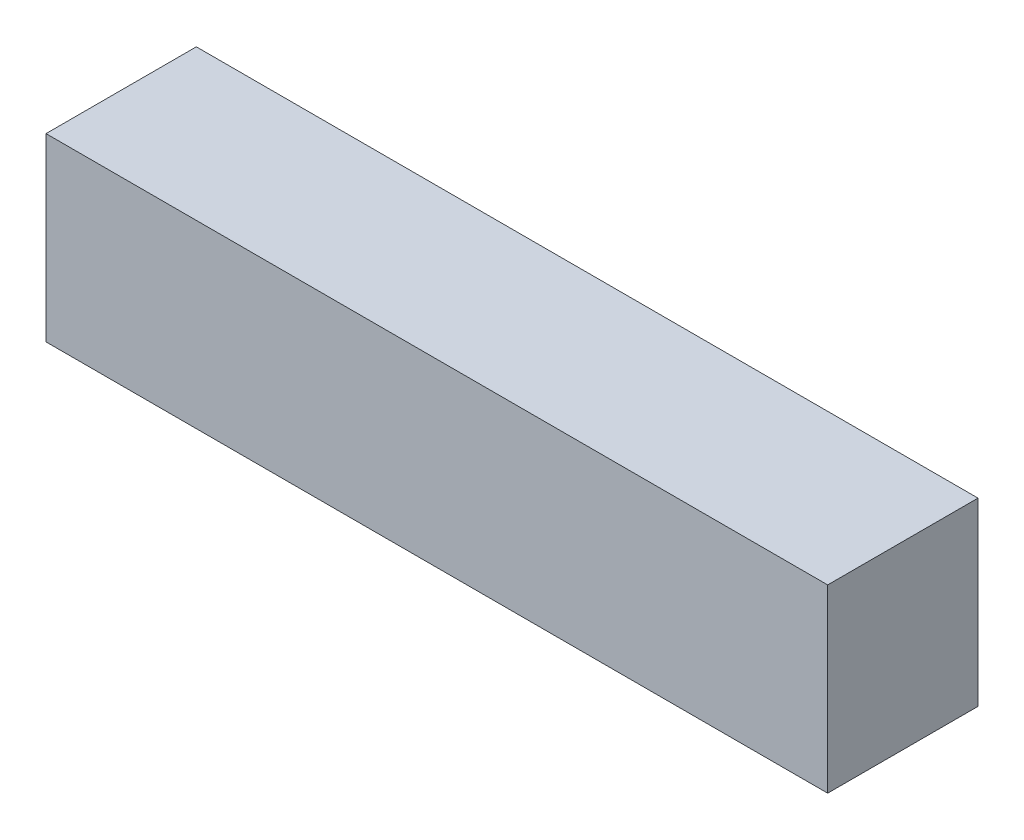
ISO-10303-21;
HEADER;
FILE_DESCRIPTION(('STEP AP214'),'2;1');
FILE_NAME('part.step','',(''),(''),'','','');
FILE_SCHEMA(('AUTOMOTIVE_DESIGN { 1 0 10303 214 1 1 1 1 }'));
ENDSEC;
DATA;
#1=APPLICATION_CONTEXT('core data for automotive mechanical design processes');
#2=APPLICATION_PROTOCOL_DEFINITION('international standard','automotive_design',2000,#1);
#3=PRODUCT_CONTEXT('',#1,'mechanical');
#4=PRODUCT('Part','Part','',(#3));
#5=PRODUCT_RELATED_PRODUCT_CATEGORY('part','',(#4));
#6=PRODUCT_DEFINITION_FORMATION('','',#4);
#7=PRODUCT_DEFINITION_CONTEXT('part definition',#1,'design');
#8=PRODUCT_DEFINITION('design','',#6,#7);
#9=PRODUCT_DEFINITION_SHAPE('','',#8);
#10=(LENGTH_UNIT() NAMED_UNIT(*) SI_UNIT(.MILLI.,.METRE.));
#11=(NAMED_UNIT(*) PLANE_ANGLE_UNIT() SI_UNIT($,.RADIAN.));
#12=(NAMED_UNIT(*) SI_UNIT($,.STERADIAN.) SOLID_ANGLE_UNIT());
#13=UNCERTAINTY_MEASURE_WITH_UNIT(LENGTH_MEASURE(1.E-05),#10,'distance_accuracy_value','');
#14=(GEOMETRIC_REPRESENTATION_CONTEXT(3) GLOBAL_UNCERTAINTY_ASSIGNED_CONTEXT((#13)) GLOBAL_UNIT_ASSIGNED_CONTEXT((#10,
#11,#12)) REPRESENTATION_CONTEXT('',''));
#15=CARTESIAN_POINT('',(0.,0.,0.));
#16=DIRECTION('',(0.,0.,1.));
#17=DIRECTION('',(1.,0.,0.));
#18=AXIS2_PLACEMENT_3D('',#15,#16,#17);
#19=CARTESIAN_POINT('',(78.,36.,15.));
#20=DIRECTION('',(-1.,0.,0.));
#21=DIRECTION('',(0.,0.,1.));
#22=AXIS2_PLACEMENT_3D('',#19,#20,#21);
#23=PLANE('',#22);
#24=DIRECTION('',(0.,0.,-1.));
#25=VECTOR('',#24,1.);
#26=CARTESIAN_POINT('',(78.,0.,15.));
#27=LINE('',#26,#25);
#28=CARTESIAN_POINT('',(78.,0.,15.));
#29=VERTEX_POINT('',#28);
#30=CARTESIAN_POINT('',(78.,0.,-15.));
#31=VERTEX_POINT('',#30);
#32=EDGE_CURVE('E97',#29,#31,#27,.T.);
#33=ORIENTED_EDGE('',*,*,#32,.T.);
#34=DIRECTION('',(0.,-1.,0.));
#35=VECTOR('',#34,1.);
#36=CARTESIAN_POINT('',(78.,36.,-15.));
#37=LINE('',#36,#35);
#38=CARTESIAN_POINT('',(78.,36.,-15.));
#39=VERTEX_POINT('',#38);
#40=EDGE_CURVE('E11',#39,#31,#37,.T.);
#41=ORIENTED_EDGE('',*,*,#40,.F.);
#42=DIRECTION('',(0.,0.,-1.));
#43=VECTOR('',#42,1.);
#44=CARTESIAN_POINT('',(78.,36.,15.));
#45=LINE('',#44,#43);
#46=CARTESIAN_POINT('',(78.,36.,15.));
#47=VERTEX_POINT('',#46);
#48=EDGE_CURVE('E85',#47,#39,#45,.T.);
#49=ORIENTED_EDGE('',*,*,#48,.F.);
#50=DIRECTION('',(0.,-1.,0.));
#51=VECTOR('',#50,1.);
#52=CARTESIAN_POINT('',(78.,36.,15.));
#53=LINE('',#52,#51);
#54=EDGE_CURVE('E93',#47,#29,#53,.T.);
#55=ORIENTED_EDGE('',*,*,#54,.T.);
#56=EDGE_LOOP('',(#33,#41,#49,#55));
#57=FACE_BOUND('',#56,.T.);
#58=ADVANCED_FACE('F34',(#57),#23,.F.);
#59=CARTESIAN_POINT('',(-78.,36.,-15.));
#60=DIRECTION('',(0.,0.,1.));
#61=DIRECTION('',(1.,0.,0.));
#62=AXIS2_PLACEMENT_3D('',#59,#60,#61);
#63=PLANE('',#62);
#64=DIRECTION('',(-1.,0.,0.));
#65=VECTOR('',#64,1.);
#66=CARTESIAN_POINT('',(-78.,0.,-15.));
#67=LINE('',#66,#65);
#68=CARTESIAN_POINT('',(-78.,0.,-15.));
#69=VERTEX_POINT('',#68);
#70=EDGE_CURVE('E89',#31,#69,#67,.T.);
#71=ORIENTED_EDGE('',*,*,#70,.T.);
#72=DIRECTION('',(0.,-1.,0.));
#73=VECTOR('',#72,1.);
#74=CARTESIAN_POINT('',(-78.,36.,-15.));
#75=LINE('',#74,#73);
#76=CARTESIAN_POINT('',(-78.,36.,-15.));
#77=VERTEX_POINT('',#76);
#78=EDGE_CURVE('E42',#77,#69,#75,.T.);
#79=ORIENTED_EDGE('',*,*,#78,.F.);
#80=DIRECTION('',(-1.,0.,0.));
#81=VECTOR('',#80,1.);
#82=CARTESIAN_POINT('',(-78.,36.,-15.));
#83=LINE('',#82,#81);
#84=EDGE_CURVE('E80',#39,#77,#83,.T.);
#85=ORIENTED_EDGE('',*,*,#84,.F.);
#86=ORIENTED_EDGE('',*,*,#40,.T.);
#87=EDGE_LOOP('',(#71,#79,#85,#86));
#88=FACE_BOUND('',#87,.T.);
#89=ADVANCED_FACE('F88',(#88),#63,.F.);
#90=CARTESIAN_POINT('',(-78.,36.,15.));
#91=DIRECTION('',(1.,0.,0.));
#92=DIRECTION('',(0.,0.,-1.));
#93=AXIS2_PLACEMENT_3D('',#90,#91,#92);
#94=PLANE('',#93);
#95=DIRECTION('',(0.,0.,1.));
#96=VECTOR('',#95,1.);
#97=CARTESIAN_POINT('',(-78.,0.,15.));
#98=LINE('',#97,#96);
#99=CARTESIAN_POINT('',(-78.,0.,15.));
#100=VERTEX_POINT('',#99);
#101=EDGE_CURVE('E67',#69,#100,#98,.T.);
#102=ORIENTED_EDGE('',*,*,#101,.T.);
#103=DIRECTION('',(0.,-1.,0.));
#104=VECTOR('',#103,1.);
#105=CARTESIAN_POINT('',(-78.,36.,15.));
#106=LINE('',#105,#104);
#107=CARTESIAN_POINT('',(-78.,36.,15.));
#108=VERTEX_POINT('',#107);
#109=EDGE_CURVE('E90',#108,#100,#106,.T.);
#110=ORIENTED_EDGE('',*,*,#109,.F.);
#111=DIRECTION('',(0.,0.,1.));
#112=VECTOR('',#111,1.);
#113=CARTESIAN_POINT('',(-78.,36.,15.));
#114=LINE('',#113,#112);
#115=EDGE_CURVE('E83',#77,#108,#114,.T.);
#116=ORIENTED_EDGE('',*,*,#115,.F.);
#117=ORIENTED_EDGE('',*,*,#78,.T.);
#118=EDGE_LOOP('',(#102,#110,#116,#117));
#119=FACE_BOUND('',#118,.T.);
#120=ADVANCED_FACE('F91',(#119),#94,.F.);
#121=CARTESIAN_POINT('',(-78.,36.,15.));
#122=DIRECTION('',(0.,0.,-1.));
#123=DIRECTION('',(-1.,0.,0.));
#124=AXIS2_PLACEMENT_3D('',#121,#122,#123);
#125=PLANE('',#124);
#126=DIRECTION('',(1.,0.,0.));
#127=VECTOR('',#126,1.);
#128=CARTESIAN_POINT('',(-78.,0.,15.));
#129=LINE('',#128,#127);
#130=EDGE_CURVE('E73',#100,#29,#129,.T.);
#131=ORIENTED_EDGE('',*,*,#130,.T.);
#132=ORIENTED_EDGE('',*,*,#54,.F.);
#133=DIRECTION('',(1.,0.,0.));
#134=VECTOR('',#133,1.);
#135=CARTESIAN_POINT('',(-78.,36.,15.));
#136=LINE('',#135,#134);
#137=EDGE_CURVE('E50',#108,#47,#136,.T.);
#138=ORIENTED_EDGE('',*,*,#137,.F.);
#139=ORIENTED_EDGE('',*,*,#109,.T.);
#140=EDGE_LOOP('',(#131,#132,#138,#139));
#141=FACE_BOUND('',#140,.T.);
#142=ADVANCED_FACE('F104',(#141),#125,.F.);
#143=CARTESIAN_POINT('',(0.,36.,0.));
#144=DIRECTION('',(0.,-1.,0.));
#145=DIRECTION('',(0.,0.,-1.));
#146=AXIS2_PLACEMENT_3D('',#143,#144,#145);
#147=PLANE('',#146);
#148=ORIENTED_EDGE('',*,*,#48,.T.);
#149=ORIENTED_EDGE('',*,*,#84,.T.);
#150=ORIENTED_EDGE('',*,*,#115,.T.);
#151=ORIENTED_EDGE('',*,*,#137,.T.);
#152=EDGE_LOOP('',(#148,#149,#150,#151));
#153=FACE_BOUND('',#152,.T.);
#154=ADVANCED_FACE('F81',(#153),#147,.F.);
#155=CARTESIAN_POINT('',(0.,0.,0.));
#156=DIRECTION('',(0.,-1.,0.));
#157=DIRECTION('',(0.,0.,-1.));
#158=AXIS2_PLACEMENT_3D('',#155,#156,#157);
#159=PLANE('',#158);
#160=ORIENTED_EDGE('',*,*,#32,.F.);
#161=ORIENTED_EDGE('',*,*,#130,.F.);
#162=ORIENTED_EDGE('',*,*,#101,.F.);
#163=ORIENTED_EDGE('',*,*,#70,.F.);
#164=EDGE_LOOP('',(#160,#161,#162,#163));
#165=FACE_BOUND('',#164,.T.);
#166=ADVANCED_FACE('F107',(#165),#159,.T.);
#167=CLOSED_SHELL('',(#58,#89,#120,#142,#154,#166));
#168=MANIFOLD_SOLID_BREP('B2',#167);
#169=ADVANCED_BREP_SHAPE_REPRESENTATION('',(#18,#168),#14);
#170=SHAPE_DEFINITION_REPRESENTATION(#9,#169);
ENDSEC;
END-ISO-10303-21;
